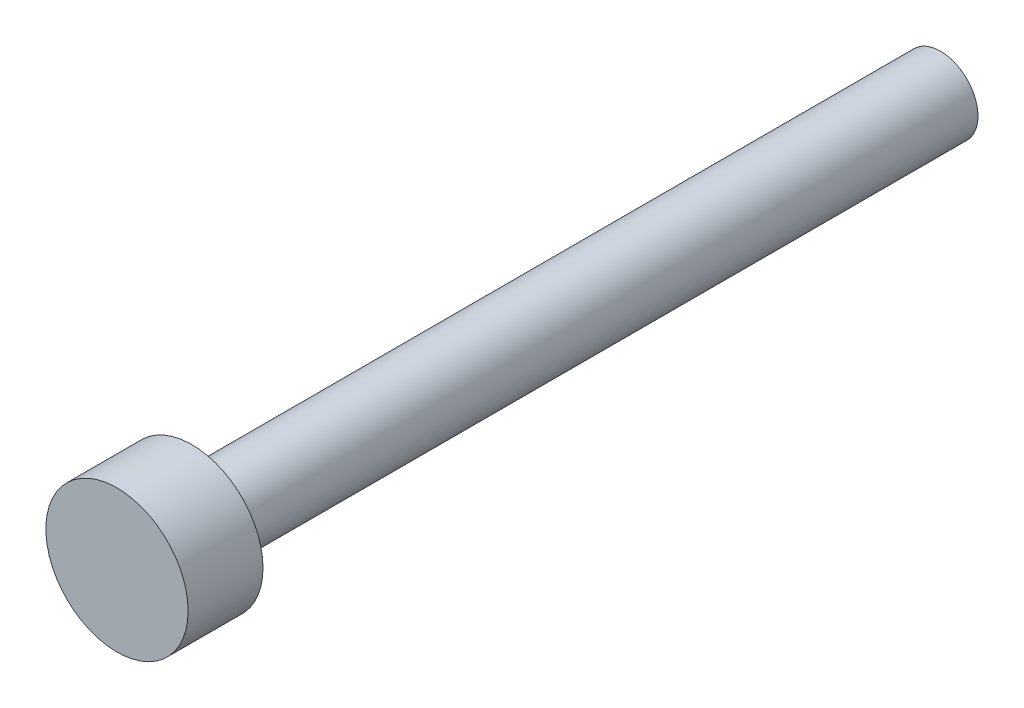
ISO-10303-21;
HEADER;
FILE_DESCRIPTION(('STEP AP214'),'2;1');
FILE_NAME('part.step','',(''),(''),'','','');
FILE_SCHEMA(('AUTOMOTIVE_DESIGN { 1 0 10303 214 1 1 1 1 }'));
ENDSEC;
DATA;
#1=APPLICATION_CONTEXT('core data for automotive mechanical design processes');
#2=APPLICATION_PROTOCOL_DEFINITION('international standard','automotive_design',2000,#1);
#3=PRODUCT_CONTEXT('',#1,'mechanical');
#4=PRODUCT('Part','Part','',(#3));
#5=PRODUCT_RELATED_PRODUCT_CATEGORY('part','',(#4));
#6=PRODUCT_DEFINITION_FORMATION('','',#4);
#7=PRODUCT_DEFINITION_CONTEXT('part definition',#1,'design');
#8=PRODUCT_DEFINITION('design','',#6,#7);
#9=PRODUCT_DEFINITION_SHAPE('','',#8);
#10=(LENGTH_UNIT() NAMED_UNIT(*) SI_UNIT(.MILLI.,.METRE.));
#11=(NAMED_UNIT(*) PLANE_ANGLE_UNIT() SI_UNIT($,.RADIAN.));
#12=(NAMED_UNIT(*) SI_UNIT($,.STERADIAN.) SOLID_ANGLE_UNIT());
#13=UNCERTAINTY_MEASURE_WITH_UNIT(LENGTH_MEASURE(1.E-05),#10,'distance_accuracy_value','');
#14=(GEOMETRIC_REPRESENTATION_CONTEXT(3) GLOBAL_UNCERTAINTY_ASSIGNED_CONTEXT((#13)) GLOBAL_UNIT_ASSIGNED_CONTEXT((#10,
#11,#12)) REPRESENTATION_CONTEXT('',''));
#15=CARTESIAN_POINT('',(0.,0.,0.));
#16=DIRECTION('',(0.,0.,1.));
#17=DIRECTION('',(1.,0.,0.));
#18=AXIS2_PLACEMENT_3D('',#15,#16,#17);
#19=CARTESIAN_POINT('',(0.,0.,0.));
#20=DIRECTION('',(0.,0.,-1.));
#21=DIRECTION('',(-1.,0.,0.));
#22=AXIS2_PLACEMENT_3D('',#19,#20,#21);
#23=CYLINDRICAL_SURFACE('',#22,1.);
#24=CARTESIAN_POINT('',(0.,0.,0.));
#25=DIRECTION('',(0.,0.,1.));
#26=DIRECTION('',(1.,0.,0.));
#27=AXIS2_PLACEMENT_3D('',#24,#25,#26);
#28=CIRCLE('',#27,1.);
#29=CARTESIAN_POINT('',(1.,0.,0.));
#30=VERTEX_POINT('',#29);
#31=EDGE_CURVE('E10',#30,#30,#28,.T.);
#32=ORIENTED_EDGE('',*,*,#31,.F.);
#33=EDGE_LOOP('',(#32));
#34=FACE_BOUND('',#33,.T.);
#35=CARTESIAN_POINT('',(0.,0.,-20.));
#36=DIRECTION('',(0.,0.,1.));
#37=DIRECTION('',(1.,0.,0.));
#38=AXIS2_PLACEMENT_3D('',#35,#36,#37);
#39=CIRCLE('',#38,1.);
#40=CARTESIAN_POINT('',(1.,0.,-20.));
#41=VERTEX_POINT('',#40);
#42=EDGE_CURVE('E37',#41,#41,#39,.T.);
#43=ORIENTED_EDGE('',*,*,#42,.T.);
#44=EDGE_LOOP('',(#43));
#45=FACE_BOUND('',#44,.T.);
#46=ADVANCED_FACE('F40',(#34,#45),#23,.T.);
#47=CARTESIAN_POINT('',(0.,0.,-20.));
#48=DIRECTION('',(0.,0.,1.));
#49=DIRECTION('',(1.,0.,0.));
#50=AXIS2_PLACEMENT_3D('',#47,#48,#49);
#51=PLANE('',#50);
#52=ORIENTED_EDGE('',*,*,#42,.F.);
#53=EDGE_LOOP('',(#52));
#54=FACE_BOUND('',#53,.T.);
#55=ADVANCED_FACE('F58',(#54),#51,.F.);
#56=CARTESIAN_POINT('',(0.,0.,2.));
#57=DIRECTION('',(0.,0.,-1.));
#58=DIRECTION('',(-1.,0.,0.));
#59=AXIS2_PLACEMENT_3D('',#56,#57,#58);
#60=CYLINDRICAL_SURFACE('',#59,1.9);
#61=CARTESIAN_POINT('',(0.,0.,2.));
#62=DIRECTION('',(0.,0.,1.));
#63=DIRECTION('',(1.,0.,0.));
#64=AXIS2_PLACEMENT_3D('',#61,#62,#63);
#65=CIRCLE('',#64,1.9);
#66=CARTESIAN_POINT('',(1.9,0.,2.));
#67=VERTEX_POINT('',#66);
#68=EDGE_CURVE('E50',#67,#67,#65,.T.);
#69=ORIENTED_EDGE('',*,*,#68,.F.);
#70=EDGE_LOOP('',(#69));
#71=FACE_BOUND('',#70,.T.);
#72=CARTESIAN_POINT('',(0.,0.,0.));
#73=DIRECTION('',(0.,0.,1.));
#74=DIRECTION('',(1.,0.,0.));
#75=AXIS2_PLACEMENT_3D('',#72,#73,#74);
#76=CIRCLE('',#75,1.9);
#77=CARTESIAN_POINT('',(1.9,0.,0.));
#78=VERTEX_POINT('',#77);
#79=EDGE_CURVE('E47',#78,#78,#76,.T.);
#80=ORIENTED_EDGE('',*,*,#79,.T.);
#81=EDGE_LOOP('',(#80));
#82=FACE_BOUND('',#81,.T.);
#83=ADVANCED_FACE('F60',(#71,#82),#60,.T.);
#84=CARTESIAN_POINT('',(0.,0.,2.));
#85=DIRECTION('',(0.,0.,1.));
#86=DIRECTION('',(1.,0.,0.));
#87=AXIS2_PLACEMENT_3D('',#84,#85,#86);
#88=PLANE('',#87);
#89=ORIENTED_EDGE('',*,*,#68,.T.);
#90=EDGE_LOOP('',(#89));
#91=FACE_BOUND('',#90,.T.);
#92=ADVANCED_FACE('F54',(#91),#88,.T.);
#93=CARTESIAN_POINT('',(0.,0.,0.));
#94=DIRECTION('',(0.,0.,1.));
#95=DIRECTION('',(1.,0.,0.));
#96=AXIS2_PLACEMENT_3D('',#93,#94,#95);
#97=PLANE('',#96);
#98=ORIENTED_EDGE('',*,*,#31,.T.);
#99=EDGE_LOOP('',(#98));
#100=FACE_BOUND('',#99,.T.);
#101=ORIENTED_EDGE('',*,*,#79,.F.);
#102=EDGE_LOOP('',(#101));
#103=FACE_BOUND('',#102,.T.);
#104=ADVANCED_FACE('F64',(#100,#103),#97,.F.);
#105=CLOSED_SHELL('',(#46,#55,#83,#92,#104));
#106=MANIFOLD_SOLID_BREP('B2',#105);
#107=ADVANCED_BREP_SHAPE_REPRESENTATION('',(#18,#106),#14);
#108=SHAPE_DEFINITION_REPRESENTATION(#9,#107);
ENDSEC;
END-ISO-10303-21;
